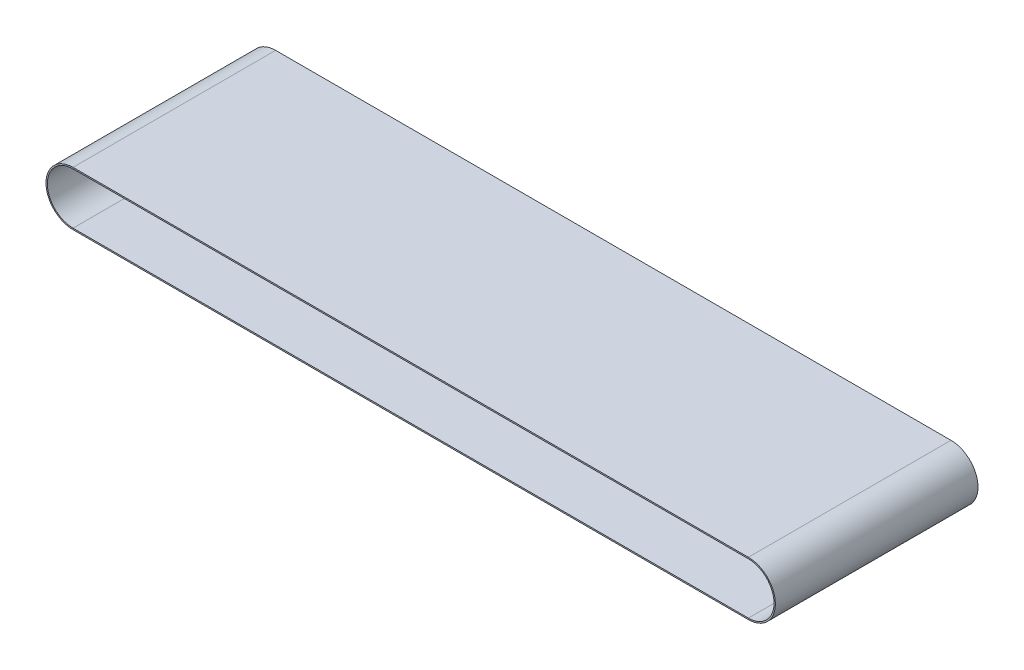
ISO-10303-21;
HEADER;
FILE_DESCRIPTION(('STEP AP214'),'2;1');
FILE_NAME('part.step','',(''),(''),'','','');
FILE_SCHEMA(('AUTOMOTIVE_DESIGN { 1 0 10303 214 1 1 1 1 }'));
ENDSEC;
DATA;
#1=APPLICATION_CONTEXT('core data for automotive mechanical design processes');
#2=APPLICATION_PROTOCOL_DEFINITION('international standard','automotive_design',2000,#1);
#3=PRODUCT_CONTEXT('',#1,'mechanical');
#4=PRODUCT('Part','Part','',(#3));
#5=PRODUCT_RELATED_PRODUCT_CATEGORY('part','',(#4));
#6=PRODUCT_DEFINITION_FORMATION('','',#4);
#7=PRODUCT_DEFINITION_CONTEXT('part definition',#1,'design');
#8=PRODUCT_DEFINITION('design','',#6,#7);
#9=PRODUCT_DEFINITION_SHAPE('','',#8);
#10=(LENGTH_UNIT() NAMED_UNIT(*) SI_UNIT(.MILLI.,.METRE.));
#11=(NAMED_UNIT(*) PLANE_ANGLE_UNIT() SI_UNIT($,.RADIAN.));
#12=(NAMED_UNIT(*) SI_UNIT($,.STERADIAN.) SOLID_ANGLE_UNIT());
#13=UNCERTAINTY_MEASURE_WITH_UNIT(LENGTH_MEASURE(1.E-05),#10,'distance_accuracy_value','');
#14=(GEOMETRIC_REPRESENTATION_CONTEXT(3) GLOBAL_UNCERTAINTY_ASSIGNED_CONTEXT((#13)) GLOBAL_UNIT_ASSIGNED_CONTEXT((#10,
#11,#12)) REPRESENTATION_CONTEXT('',''));
#15=CARTESIAN_POINT('',(0.,0.,0.));
#16=DIRECTION('',(0.,0.,1.));
#17=DIRECTION('',(1.,0.,0.));
#18=AXIS2_PLACEMENT_3D('',#15,#16,#17);
#19=CARTESIAN_POINT('',(-500.,0.,150.));
#20=DIRECTION('',(0.,0.,1.));
#21=DIRECTION('',(1.,0.,0.));
#22=AXIS2_PLACEMENT_3D('',#19,#20,#21);
#23=PLANE('',#22);
#24=CARTESIAN_POINT('',(-500.,0.,150.));
#25=DIRECTION('',(0.,0.,1.));
#26=DIRECTION('',(1.,0.,0.));
#27=AXIS2_PLACEMENT_3D('',#24,#25,#26);
#28=CIRCLE('',#27,40.);
#29=CARTESIAN_POINT('',(-500.,40.0000000000001,150.));
#30=VERTEX_POINT('',#29);
#31=CARTESIAN_POINT('',(-500.,-39.9999999999999,150.));
#32=VERTEX_POINT('',#31);
#33=EDGE_CURVE('E169',#30,#32,#28,.T.);
#34=ORIENTED_EDGE('',*,*,#33,.T.);
#35=DIRECTION('',(1.,0.,0.));
#36=VECTOR('',#35,1.);
#37=CARTESIAN_POINT('',(-500.,-39.9999999999999,150.));
#38=LINE('',#37,#36);
#39=CARTESIAN_POINT('',(500.,-39.9999999999999,150.));
#40=VERTEX_POINT('',#39);
#41=EDGE_CURVE('E173',#32,#40,#38,.T.);
#42=ORIENTED_EDGE('',*,*,#41,.T.);
#43=CARTESIAN_POINT('',(500.,1.83697019872103E-13,150.));
#44=DIRECTION('',(0.,0.,1.));
#45=DIRECTION('',(1.,0.,0.));
#46=AXIS2_PLACEMENT_3D('',#43,#44,#45);
#47=CIRCLE('',#46,40.);
#48=CARTESIAN_POINT('',(500.,40.0000000000002,150.));
#49=VERTEX_POINT('',#48);
#50=EDGE_CURVE('E175',#40,#49,#47,.T.);
#51=ORIENTED_EDGE('',*,*,#50,.T.);
#52=DIRECTION('',(-1.,0.,0.));
#53=VECTOR('',#52,1.);
#54=CARTESIAN_POINT('',(-500.,40.0000000000001,150.));
#55=LINE('',#54,#53);
#56=EDGE_CURVE('E177',#49,#30,#55,.T.);
#57=ORIENTED_EDGE('',*,*,#56,.T.);
#58=EDGE_LOOP('',(#34,#42,#51,#57));
#59=FACE_BOUND('',#58,.T.);
#60=DIRECTION('',(1.,0.,0.));
#61=VECTOR('',#60,1.);
#62=CARTESIAN_POINT('',(-500.,-37.9999999999999,150.));
#63=LINE('',#62,#61);
#64=CARTESIAN_POINT('',(-500.,-37.9999999999999,150.));
#65=VERTEX_POINT('',#64);
#66=CARTESIAN_POINT('',(500.,-37.9999999999998,150.));
#67=VERTEX_POINT('',#66);
#68=EDGE_CURVE('E138',#65,#67,#63,.T.);
#69=ORIENTED_EDGE('',*,*,#68,.F.);
#70=CARTESIAN_POINT('',(-500.,0.,150.));
#71=DIRECTION('',(0.,0.,1.));
#72=DIRECTION('',(1.,0.,0.));
#73=AXIS2_PLACEMENT_3D('',#70,#71,#72);
#74=CIRCLE('',#73,38.);
#75=CARTESIAN_POINT('',(-500.,38.0000000000001,150.));
#76=VERTEX_POINT('',#75);
#77=EDGE_CURVE('E134',#76,#65,#74,.T.);
#78=ORIENTED_EDGE('',*,*,#77,.F.);
#79=DIRECTION('',(-1.,0.,0.));
#80=VECTOR('',#79,1.);
#81=CARTESIAN_POINT('',(-500.,38.0000000000001,150.));
#82=LINE('',#81,#80);
#83=CARTESIAN_POINT('',(500.,38.0000000000001,150.));
#84=VERTEX_POINT('',#83);
#85=EDGE_CURVE('E152',#84,#76,#82,.T.);
#86=ORIENTED_EDGE('',*,*,#85,.F.);
#87=CARTESIAN_POINT('',(500.,1.83697019872103E-13,150.));
#88=DIRECTION('',(0.,0.,1.));
#89=DIRECTION('',(1.,0.,0.));
#90=AXIS2_PLACEMENT_3D('',#87,#88,#89);
#91=CIRCLE('',#90,38.);
#92=EDGE_CURVE('E155',#67,#84,#91,.T.);
#93=ORIENTED_EDGE('',*,*,#92,.F.);
#94=EDGE_LOOP('',(#69,#78,#86,#93));
#95=FACE_BOUND('',#94,.T.);
#96=ADVANCED_FACE('F70',(#59,#95),#23,.T.);
#97=CARTESIAN_POINT('',(-500.,0.,-150.));
#98=DIRECTION('',(0.,0.,1.));
#99=DIRECTION('',(1.,0.,0.));
#100=AXIS2_PLACEMENT_3D('',#97,#98,#99);
#101=PLANE('',#100);
#102=CARTESIAN_POINT('',(-500.,0.,-150.));
#103=DIRECTION('',(0.,0.,1.));
#104=DIRECTION('',(1.,0.,0.));
#105=AXIS2_PLACEMENT_3D('',#102,#103,#104);
#106=CIRCLE('',#105,40.);
#107=CARTESIAN_POINT('',(-500.,40.0000000000001,-150.));
#108=VERTEX_POINT('',#107);
#109=CARTESIAN_POINT('',(-500.,-39.9999999999999,-150.));
#110=VERTEX_POINT('',#109);
#111=EDGE_CURVE('E146',#108,#110,#106,.T.);
#112=ORIENTED_EDGE('',*,*,#111,.F.);
#113=DIRECTION('',(-1.,0.,0.));
#114=VECTOR('',#113,1.);
#115=CARTESIAN_POINT('',(-500.,40.0000000000001,-150.));
#116=LINE('',#115,#114);
#117=CARTESIAN_POINT('',(500.,40.0000000000002,-150.));
#118=VERTEX_POINT('',#117);
#119=EDGE_CURVE('E174',#118,#108,#116,.T.);
#120=ORIENTED_EDGE('',*,*,#119,.F.);
#121=CARTESIAN_POINT('',(500.,1.83697019872103E-13,-150.));
#122=DIRECTION('',(0.,0.,1.));
#123=DIRECTION('',(1.,0.,0.));
#124=AXIS2_PLACEMENT_3D('',#121,#122,#123);
#125=CIRCLE('',#124,40.);
#126=CARTESIAN_POINT('',(500.,-39.9999999999999,-150.));
#127=VERTEX_POINT('',#126);
#128=EDGE_CURVE('E181',#127,#118,#125,.T.);
#129=ORIENTED_EDGE('',*,*,#128,.F.);
#130=DIRECTION('',(1.,0.,0.));
#131=VECTOR('',#130,1.);
#132=CARTESIAN_POINT('',(-500.,-39.9999999999999,-150.));
#133=LINE('',#132,#131);
#134=EDGE_CURVE('E182',#110,#127,#133,.T.);
#135=ORIENTED_EDGE('',*,*,#134,.F.);
#136=EDGE_LOOP('',(#112,#120,#129,#135));
#137=FACE_BOUND('',#136,.T.);
#138=CARTESIAN_POINT('',(-500.,0.,-150.));
#139=DIRECTION('',(0.,0.,1.));
#140=DIRECTION('',(1.,0.,0.));
#141=AXIS2_PLACEMENT_3D('',#138,#139,#140);
#142=CIRCLE('',#141,38.);
#143=CARTESIAN_POINT('',(-500.,38.0000000000001,-150.));
#144=VERTEX_POINT('',#143);
#145=CARTESIAN_POINT('',(-500.,-37.9999999999999,-150.));
#146=VERTEX_POINT('',#145);
#147=EDGE_CURVE('E89',#144,#146,#142,.T.);
#148=ORIENTED_EDGE('',*,*,#147,.T.);
#149=DIRECTION('',(1.,0.,0.));
#150=VECTOR('',#149,1.);
#151=CARTESIAN_POINT('',(-500.,-37.9999999999999,-150.));
#152=LINE('',#151,#150);
#153=CARTESIAN_POINT('',(500.,-37.9999999999998,-150.));
#154=VERTEX_POINT('',#153);
#155=EDGE_CURVE('E150',#146,#154,#152,.T.);
#156=ORIENTED_EDGE('',*,*,#155,.T.);
#157=CARTESIAN_POINT('',(500.,1.83697019872103E-13,-150.));
#158=DIRECTION('',(0.,0.,1.));
#159=DIRECTION('',(1.,0.,0.));
#160=AXIS2_PLACEMENT_3D('',#157,#158,#159);
#161=CIRCLE('',#160,38.);
#162=CARTESIAN_POINT('',(500.,38.0000000000001,-150.));
#163=VERTEX_POINT('',#162);
#164=EDGE_CURVE('E159',#154,#163,#161,.T.);
#165=ORIENTED_EDGE('',*,*,#164,.T.);
#166=DIRECTION('',(-1.,0.,0.));
#167=VECTOR('',#166,1.);
#168=CARTESIAN_POINT('',(-500.,38.0000000000001,-150.));
#169=LINE('',#168,#167);
#170=EDGE_CURVE('E143',#163,#144,#169,.T.);
#171=ORIENTED_EDGE('',*,*,#170,.T.);
#172=EDGE_LOOP('',(#148,#156,#165,#171));
#173=FACE_BOUND('',#172,.T.);
#174=ADVANCED_FACE('F203',(#137,#173),#101,.F.);
#175=CARTESIAN_POINT('',(-500.,0.,150.));
#176=DIRECTION('',(0.,0.,-1.));
#177=DIRECTION('',(-1.,0.,0.));
#178=AXIS2_PLACEMENT_3D('',#175,#176,#177);
#179=CYLINDRICAL_SURFACE('',#178,40.);
#180=ORIENTED_EDGE('',*,*,#111,.T.);
#181=DIRECTION('',(0.,0.,-1.));
#182=VECTOR('',#181,1.);
#183=CARTESIAN_POINT('',(-500.,-39.9999999999999,150.));
#184=LINE('',#183,#182);
#185=EDGE_CURVE('E12',#32,#110,#184,.T.);
#186=ORIENTED_EDGE('',*,*,#185,.F.);
#187=ORIENTED_EDGE('',*,*,#33,.F.);
#188=DIRECTION('',(0.,0.,-1.));
#189=VECTOR('',#188,1.);
#190=CARTESIAN_POINT('',(-500.,40.0000000000001,150.));
#191=LINE('',#190,#189);
#192=EDGE_CURVE('E179',#30,#108,#191,.T.);
#193=ORIENTED_EDGE('',*,*,#192,.T.);
#194=EDGE_LOOP('',(#180,#186,#187,#193));
#195=FACE_BOUND('',#194,.T.);
#196=ADVANCED_FACE('F66',(#195),#179,.T.);
#197=CARTESIAN_POINT('',(-500.,-39.9999999999999,150.));
#198=DIRECTION('',(0.,1.,0.));
#199=DIRECTION('',(0.,0.,1.));
#200=AXIS2_PLACEMENT_3D('',#197,#198,#199);
#201=PLANE('',#200);
#202=ORIENTED_EDGE('',*,*,#134,.T.);
#203=DIRECTION('',(0.,0.,-1.));
#204=VECTOR('',#203,1.);
#205=CARTESIAN_POINT('',(500.,-39.9999999999999,150.));
#206=LINE('',#205,#204);
#207=EDGE_CURVE('E73',#40,#127,#206,.T.);
#208=ORIENTED_EDGE('',*,*,#207,.F.);
#209=ORIENTED_EDGE('',*,*,#41,.F.);
#210=ORIENTED_EDGE('',*,*,#185,.T.);
#211=EDGE_LOOP('',(#202,#208,#209,#210));
#212=FACE_BOUND('',#211,.T.);
#213=ADVANCED_FACE('F211',(#212),#201,.F.);
#214=CARTESIAN_POINT('',(500.,1.83697019872103E-13,150.));
#215=DIRECTION('',(0.,0.,-1.));
#216=DIRECTION('',(-1.,0.,0.));
#217=AXIS2_PLACEMENT_3D('',#214,#215,#216);
#218=CYLINDRICAL_SURFACE('',#217,40.);
#219=ORIENTED_EDGE('',*,*,#128,.T.);
#220=DIRECTION('',(0.,0.,-1.));
#221=VECTOR('',#220,1.);
#222=CARTESIAN_POINT('',(500.,40.0000000000002,150.));
#223=LINE('',#222,#221);
#224=EDGE_CURVE('E187',#49,#118,#223,.T.);
#225=ORIENTED_EDGE('',*,*,#224,.F.);
#226=ORIENTED_EDGE('',*,*,#50,.F.);
#227=ORIENTED_EDGE('',*,*,#207,.T.);
#228=EDGE_LOOP('',(#219,#225,#226,#227));
#229=FACE_BOUND('',#228,.T.);
#230=ADVANCED_FACE('F193',(#229),#218,.T.);
#231=CARTESIAN_POINT('',(-500.,40.0000000000001,150.));
#232=DIRECTION('',(0.,-1.,0.));
#233=DIRECTION('',(0.,0.,-1.));
#234=AXIS2_PLACEMENT_3D('',#231,#232,#233);
#235=PLANE('',#234);
#236=ORIENTED_EDGE('',*,*,#119,.T.);
#237=ORIENTED_EDGE('',*,*,#192,.F.);
#238=ORIENTED_EDGE('',*,*,#56,.F.);
#239=ORIENTED_EDGE('',*,*,#224,.T.);
#240=EDGE_LOOP('',(#236,#237,#238,#239));
#241=FACE_BOUND('',#240,.T.);
#242=ADVANCED_FACE('F202',(#241),#235,.F.);
#243=CARTESIAN_POINT('',(-500.,0.,150.));
#244=DIRECTION('',(0.,0.,-1.));
#245=DIRECTION('',(-1.,0.,0.));
#246=AXIS2_PLACEMENT_3D('',#243,#244,#245);
#247=CYLINDRICAL_SURFACE('',#246,38.);
#248=ORIENTED_EDGE('',*,*,#147,.F.);
#249=DIRECTION('',(0.,0.,-1.));
#250=VECTOR('',#249,1.);
#251=CARTESIAN_POINT('',(-500.,38.0000000000001,150.));
#252=LINE('',#251,#250);
#253=EDGE_CURVE('E137',#76,#144,#252,.T.);
#254=ORIENTED_EDGE('',*,*,#253,.F.);
#255=ORIENTED_EDGE('',*,*,#77,.T.);
#256=DIRECTION('',(0.,0.,-1.));
#257=VECTOR('',#256,1.);
#258=CARTESIAN_POINT('',(-500.,-37.9999999999999,150.));
#259=LINE('',#258,#257);
#260=EDGE_CURVE('E131',#65,#146,#259,.T.);
#261=ORIENTED_EDGE('',*,*,#260,.T.);
#262=EDGE_LOOP('',(#248,#254,#255,#261));
#263=FACE_BOUND('',#262,.T.);
#264=ADVANCED_FACE('F135',(#263),#247,.F.);
#265=CARTESIAN_POINT('',(-500.,-37.9999999999999,150.));
#266=DIRECTION('',(0.,1.,0.));
#267=DIRECTION('',(0.,0.,1.));
#268=AXIS2_PLACEMENT_3D('',#265,#266,#267);
#269=PLANE('',#268);
#270=ORIENTED_EDGE('',*,*,#155,.F.);
#271=ORIENTED_EDGE('',*,*,#260,.F.);
#272=ORIENTED_EDGE('',*,*,#68,.T.);
#273=DIRECTION('',(0.,0.,-1.));
#274=VECTOR('',#273,1.);
#275=CARTESIAN_POINT('',(500.,-37.9999999999998,150.));
#276=LINE('',#275,#274);
#277=EDGE_CURVE('E149',#67,#154,#276,.T.);
#278=ORIENTED_EDGE('',*,*,#277,.T.);
#279=EDGE_LOOP('',(#270,#271,#272,#278));
#280=FACE_BOUND('',#279,.T.);
#281=ADVANCED_FACE('F145',(#280),#269,.T.);
#282=CARTESIAN_POINT('',(500.,1.83697019872103E-13,150.));
#283=DIRECTION('',(0.,0.,-1.));
#284=DIRECTION('',(-1.,0.,0.));
#285=AXIS2_PLACEMENT_3D('',#282,#283,#284);
#286=CYLINDRICAL_SURFACE('',#285,38.);
#287=ORIENTED_EDGE('',*,*,#164,.F.);
#288=ORIENTED_EDGE('',*,*,#277,.F.);
#289=ORIENTED_EDGE('',*,*,#92,.T.);
#290=DIRECTION('',(0.,0.,-1.));
#291=VECTOR('',#290,1.);
#292=CARTESIAN_POINT('',(500.,38.0000000000001,150.));
#293=LINE('',#292,#291);
#294=EDGE_CURVE('E85',#84,#163,#293,.T.);
#295=ORIENTED_EDGE('',*,*,#294,.T.);
#296=EDGE_LOOP('',(#287,#288,#289,#295));
#297=FACE_BOUND('',#296,.T.);
#298=ADVANCED_FACE('F231',(#297),#286,.F.);
#299=CARTESIAN_POINT('',(-500.,38.0000000000001,150.));
#300=DIRECTION('',(0.,-1.,0.));
#301=DIRECTION('',(0.,0.,-1.));
#302=AXIS2_PLACEMENT_3D('',#299,#300,#301);
#303=PLANE('',#302);
#304=ORIENTED_EDGE('',*,*,#170,.F.);
#305=ORIENTED_EDGE('',*,*,#294,.F.);
#306=ORIENTED_EDGE('',*,*,#85,.T.);
#307=ORIENTED_EDGE('',*,*,#253,.T.);
#308=EDGE_LOOP('',(#304,#305,#306,#307));
#309=FACE_BOUND('',#308,.T.);
#310=ADVANCED_FACE('F236',(#309),#303,.T.);
#311=CLOSED_SHELL('',(#96,#174,#196,#213,#230,#242,#264,#281,#298,#310));
#312=MANIFOLD_SOLID_BREP('B2',#311);
#313=ADVANCED_BREP_SHAPE_REPRESENTATION('',(#18,#312),#14);
#314=SHAPE_DEFINITION_REPRESENTATION(#9,#313);
ENDSEC;
END-ISO-10303-21;
